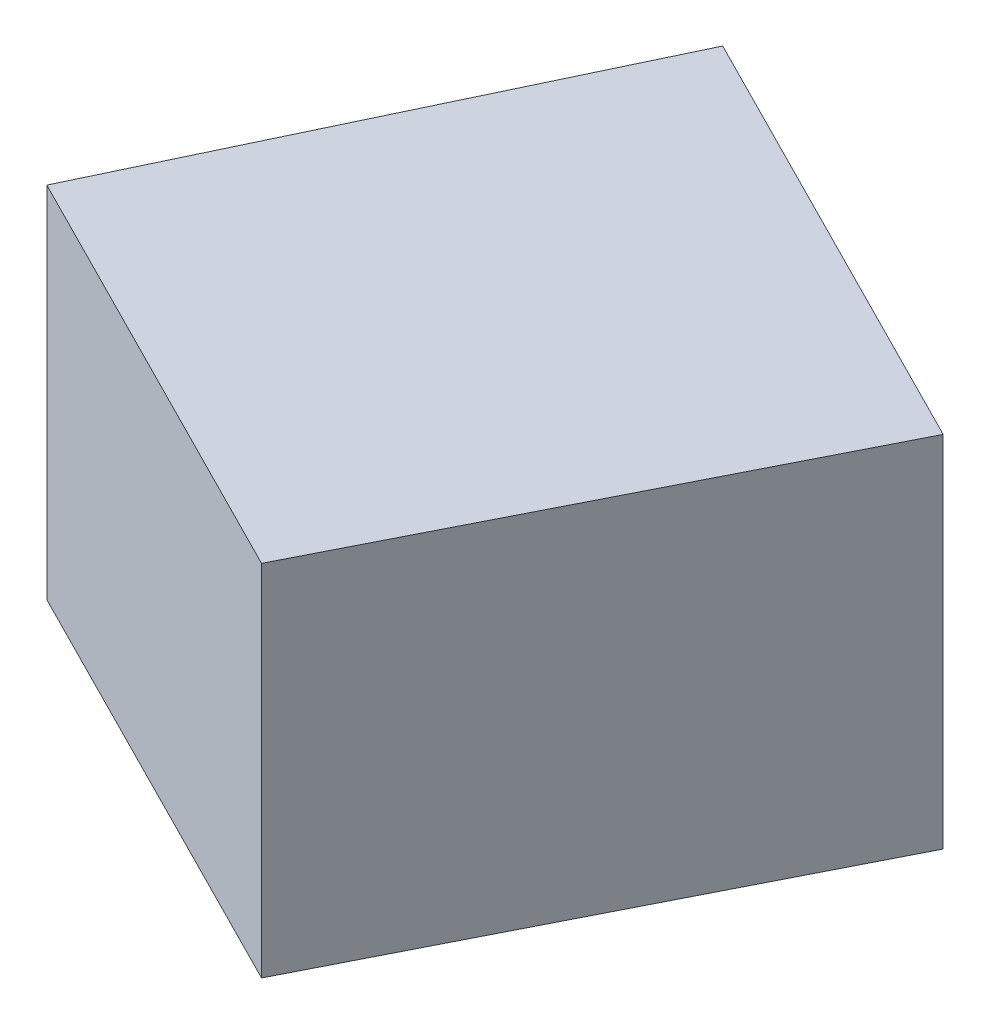
ISO-10303-21;
HEADER;
FILE_DESCRIPTION(('STEP AP214'),'2;1');
FILE_NAME('part.step','',(''),(''),'','','');
FILE_SCHEMA(('AUTOMOTIVE_DESIGN { 1 0 10303 214 1 1 1 1 }'));
ENDSEC;
DATA;
#1=APPLICATION_CONTEXT('core data for automotive mechanical design processes');
#2=APPLICATION_PROTOCOL_DEFINITION('international standard','automotive_design',2000,#1);
#3=PRODUCT_CONTEXT('',#1,'mechanical');
#4=PRODUCT('Part','Part','',(#3));
#5=PRODUCT_RELATED_PRODUCT_CATEGORY('part','',(#4));
#6=PRODUCT_DEFINITION_FORMATION('','',#4);
#7=PRODUCT_DEFINITION_CONTEXT('part definition',#1,'design');
#8=PRODUCT_DEFINITION('design','',#6,#7);
#9=PRODUCT_DEFINITION_SHAPE('','',#8);
#10=(LENGTH_UNIT() NAMED_UNIT(*) SI_UNIT(.MILLI.,.METRE.));
#11=(NAMED_UNIT(*) PLANE_ANGLE_UNIT() SI_UNIT($,.RADIAN.));
#12=(NAMED_UNIT(*) SI_UNIT($,.STERADIAN.) SOLID_ANGLE_UNIT());
#13=UNCERTAINTY_MEASURE_WITH_UNIT(LENGTH_MEASURE(1.E-05),#10,'distance_accuracy_value','');
#14=(GEOMETRIC_REPRESENTATION_CONTEXT(3) GLOBAL_UNCERTAINTY_ASSIGNED_CONTEXT((#13)) GLOBAL_UNIT_ASSIGNED_CONTEXT((#10,
#11,#12)) REPRESENTATION_CONTEXT('',''));
#15=CARTESIAN_POINT('',(0.,0.,0.));
#16=DIRECTION('',(0.,0.,1.));
#17=DIRECTION('',(1.,0.,0.));
#18=AXIS2_PLACEMENT_3D('',#15,#16,#17);
#19=CARTESIAN_POINT('',(199.372689919812,12.4979172796225,196.365071116995));
#20=DIRECTION('',(0.903480360145151,0.,0.428629488990186));
#21=DIRECTION('',(0.428629488990186,0.,-0.903480360145151));
#22=AXIS2_PLACEMENT_3D('',#19,#20,#21);
#23=PLANE('',#22);
#24=DIRECTION('',(-0.428629488990186,0.,0.903480360145151));
#25=VECTOR('',#24,1.);
#26=CARTESIAN_POINT('',(199.372689919812,-44.5020827203775,196.365071116995));
#27=LINE('',#26,#25);
#28=CARTESIAN_POINT('',(199.372689919812,-44.5020827203775,196.365071116995));
#29=VERTEX_POINT('',#28);
#30=CARTESIAN_POINT('',(164.850851240354,-44.5020827203775,269.131420712937));
#31=VERTEX_POINT('',#30);
#32=EDGE_CURVE('E110',#29,#31,#27,.T.);
#33=ORIENTED_EDGE('',*,*,#32,.T.);
#34=DIRECTION('',(0.,-1.,0.));
#35=VECTOR('',#34,1.);
#36=CARTESIAN_POINT('',(164.850851240354,12.4979172796225,269.131420712937));
#37=LINE('',#36,#35);
#38=CARTESIAN_POINT('',(164.850851240354,12.4979172796225,269.131420712937));
#39=VERTEX_POINT('',#38);
#40=EDGE_CURVE('E11',#39,#31,#37,.T.);
#41=ORIENTED_EDGE('',*,*,#40,.F.);
#42=DIRECTION('',(-0.428629488990186,0.,0.903480360145151));
#43=VECTOR('',#42,1.);
#44=CARTESIAN_POINT('',(199.372689919812,12.4979172796225,196.365071116995));
#45=LINE('',#44,#43);
#46=CARTESIAN_POINT('',(199.372689919812,12.4979172796225,196.365071116995));
#47=VERTEX_POINT('',#46);
#48=EDGE_CURVE('E94',#47,#39,#45,.T.);
#49=ORIENTED_EDGE('',*,*,#48,.F.);
#50=DIRECTION('',(0.,-1.,0.));
#51=VECTOR('',#50,1.);
#52=CARTESIAN_POINT('',(199.372689919812,12.4979172796225,196.365071116995));
#53=LINE('',#52,#51);
#54=EDGE_CURVE('E106',#47,#29,#53,.T.);
#55=ORIENTED_EDGE('',*,*,#54,.T.);
#56=EDGE_LOOP('',(#33,#41,#49,#55));
#57=FACE_BOUND('',#56,.T.);
#58=ADVANCED_FACE('F42',(#57),#23,.F.);
#59=CARTESIAN_POINT('',(164.850851240354,12.4979172796225,269.131420712937));
#60=DIRECTION('',(0.451725143369731,0.,-0.892157158155219));
#61=DIRECTION('',(-0.892157158155219,0.,-0.451725143369731));
#62=AXIS2_PLACEMENT_3D('',#59,#60,#61);
#63=PLANE('',#62);
#64=DIRECTION('',(0.892157158155219,0.,0.451725143369731));
#65=VECTOR('',#64,1.);
#66=CARTESIAN_POINT('',(164.850851240354,-44.5020827203775,269.131420712937));
#67=LINE('',#66,#65);
#68=CARTESIAN_POINT('',(233.89452859927,-44.5020827203775,304.090244692135));
#69=VERTEX_POINT('',#68);
#70=EDGE_CURVE('E99',#31,#69,#67,.T.);
#71=ORIENTED_EDGE('',*,*,#70,.T.);
#72=DIRECTION('',(0.,-1.,0.));
#73=VECTOR('',#72,1.);
#74=CARTESIAN_POINT('',(233.89452859927,12.4979172796225,304.090244692135));
#75=LINE('',#74,#73);
#76=CARTESIAN_POINT('',(233.89452859927,12.4979172796225,304.090244692135));
#77=VERTEX_POINT('',#76);
#78=EDGE_CURVE('E51',#77,#69,#75,.T.);
#79=ORIENTED_EDGE('',*,*,#78,.F.);
#80=DIRECTION('',(0.892157158155219,0.,0.451725143369731));
#81=VECTOR('',#80,1.);
#82=CARTESIAN_POINT('',(164.850851240354,12.4979172796225,269.131420712937));
#83=LINE('',#82,#81);
#84=EDGE_CURVE('E89',#39,#77,#83,.T.);
#85=ORIENTED_EDGE('',*,*,#84,.F.);
#86=ORIENTED_EDGE('',*,*,#40,.T.);
#87=EDGE_LOOP('',(#71,#79,#85,#86));
#88=FACE_BOUND('',#87,.T.);
#89=ADVANCED_FACE('F98',(#88),#63,.F.);
#90=CARTESIAN_POINT('',(233.89452859927,12.4979172796225,304.090244692135));
#91=DIRECTION('',(-0.892157158155218,0.,-0.451725143369731));
#92=DIRECTION('',(-0.451725143369731,0.,0.892157158155219));
#93=AXIS2_PLACEMENT_3D('',#90,#91,#92);
#94=PLANE('',#93);
#95=DIRECTION('',(0.451725143369731,0.,-0.892157158155218));
#96=VECTOR('',#95,1.);
#97=CARTESIAN_POINT('',(233.89452859927,-44.5020827203775,304.090244692135));
#98=LINE('',#97,#96);
#99=CARTESIAN_POINT('',(270.264456747505,-44.5020827203775,232.259636599372));
#100=VERTEX_POINT('',#99);
#101=EDGE_CURVE('E76',#69,#100,#98,.T.);
#102=ORIENTED_EDGE('',*,*,#101,.T.);
#103=DIRECTION('',(0.,-1.,0.));
#104=VECTOR('',#103,1.);
#105=CARTESIAN_POINT('',(270.264456747505,12.4979172796225,232.259636599372));
#106=LINE('',#105,#104);
#107=CARTESIAN_POINT('',(270.264456747505,12.4979172796225,232.259636599372));
#108=VERTEX_POINT('',#107);
#109=EDGE_CURVE('E101',#108,#100,#106,.T.);
#110=ORIENTED_EDGE('',*,*,#109,.F.);
#111=DIRECTION('',(0.451725143369731,0.,-0.892157158155218));
#112=VECTOR('',#111,1.);
#113=CARTESIAN_POINT('',(233.89452859927,12.4979172796225,304.090244692135));
#114=LINE('',#113,#112);
#115=EDGE_CURVE('E92',#77,#108,#114,.T.);
#116=ORIENTED_EDGE('',*,*,#115,.F.);
#117=ORIENTED_EDGE('',*,*,#78,.T.);
#118=EDGE_LOOP('',(#102,#110,#116,#117));
#119=FACE_BOUND('',#118,.T.);
#120=ADVANCED_FACE('F102',(#119),#94,.F.);
#121=CARTESIAN_POINT('',(270.264456747505,12.4979172796225,232.259636599372));
#122=DIRECTION('',(-0.451725143369732,0.,0.892157158155218));
#123=DIRECTION('',(0.892157158155218,0.,0.451725143369732));
#124=AXIS2_PLACEMENT_3D('',#121,#122,#123);
#125=PLANE('',#124);
#126=DIRECTION('',(-0.892157158155218,0.,-0.451725143369732));
#127=VECTOR('',#126,1.);
#128=CARTESIAN_POINT('',(270.264456747505,-44.5020827203775,232.259636599372));
#129=LINE('',#128,#127);
#130=EDGE_CURVE('E82',#100,#29,#129,.T.);
#131=ORIENTED_EDGE('',*,*,#130,.T.);
#132=ORIENTED_EDGE('',*,*,#54,.F.);
#133=DIRECTION('',(-0.892157158155218,0.,-0.451725143369732));
#134=VECTOR('',#133,1.);
#135=CARTESIAN_POINT('',(270.264456747505,12.4979172796225,232.259636599372));
#136=LINE('',#135,#134);
#137=EDGE_CURVE('E59',#108,#47,#136,.T.);
#138=ORIENTED_EDGE('',*,*,#137,.F.);
#139=ORIENTED_EDGE('',*,*,#109,.T.);
#140=EDGE_LOOP('',(#131,#132,#138,#139));
#141=FACE_BOUND('',#140,.T.);
#142=ADVANCED_FACE('F123',(#141),#125,.F.);
#143=CARTESIAN_POINT('',(225.907442725051,12.4979172796225,261.850974157048));
#144=DIRECTION('',(0.,1.,0.));
#145=DIRECTION('',(0.,0.,1.));
#146=AXIS2_PLACEMENT_3D('',#143,#144,#145);
#147=PLANE('',#146);
#148=ORIENTED_EDGE('',*,*,#48,.T.);
#149=ORIENTED_EDGE('',*,*,#84,.T.);
#150=ORIENTED_EDGE('',*,*,#115,.T.);
#151=ORIENTED_EDGE('',*,*,#137,.T.);
#152=EDGE_LOOP('',(#148,#149,#150,#151));
#153=FACE_BOUND('',#152,.T.);
#154=ADVANCED_FACE('F90',(#153),#147,.T.);
#155=CARTESIAN_POINT('',(225.907442725051,-44.5020827203775,261.850974157048));
#156=DIRECTION('',(0.,1.,0.));
#157=DIRECTION('',(0.,0.,1.));
#158=AXIS2_PLACEMENT_3D('',#155,#156,#157);
#159=PLANE('',#158);
#160=ORIENTED_EDGE('',*,*,#32,.F.);
#161=ORIENTED_EDGE('',*,*,#130,.F.);
#162=ORIENTED_EDGE('',*,*,#101,.F.);
#163=ORIENTED_EDGE('',*,*,#70,.F.);
#164=EDGE_LOOP('',(#160,#161,#162,#163));
#165=FACE_BOUND('',#164,.T.);
#166=ADVANCED_FACE('F126',(#165),#159,.F.);
#167=CLOSED_SHELL('',(#58,#89,#120,#142,#154,#166));
#168=MANIFOLD_SOLID_BREP('B2',#167);
#169=ADVANCED_BREP_SHAPE_REPRESENTATION('',(#18,#168),#14);
#170=SHAPE_DEFINITION_REPRESENTATION(#9,#169);
ENDSEC;
END-ISO-10303-21;
